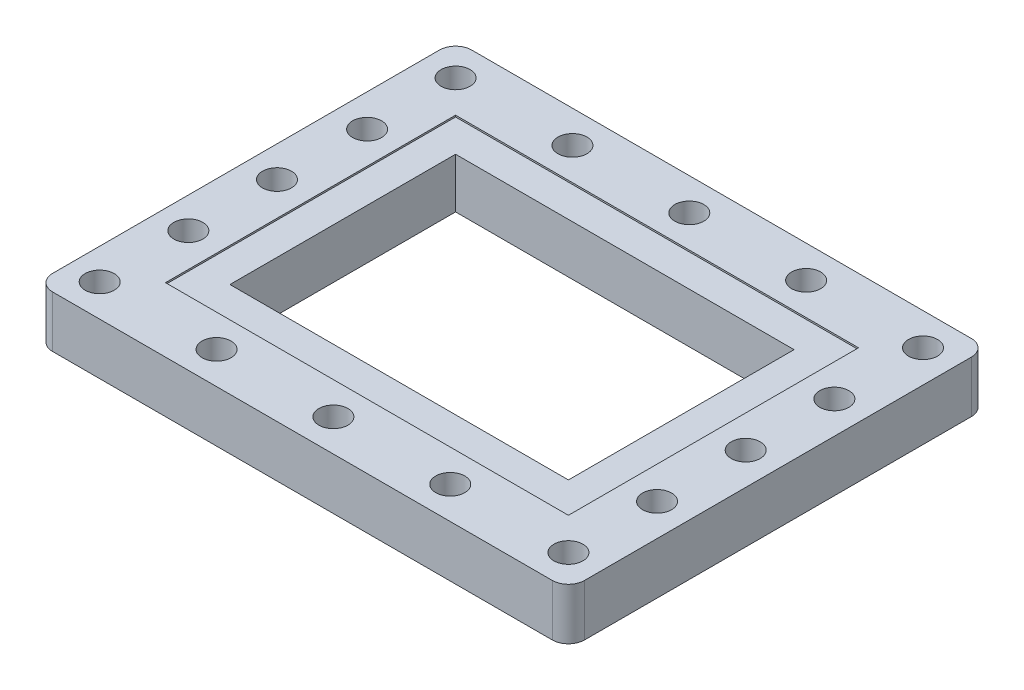
ISO-10303-21;
HEADER;
FILE_DESCRIPTION(('STEP AP214'),'2;1');
FILE_NAME('part.step','',(''),(''),'','','');
FILE_SCHEMA(('AUTOMOTIVE_DESIGN { 1 0 10303 214 1 1 1 1 }'));
ENDSEC;
DATA;
#1=APPLICATION_CONTEXT('core data for automotive mechanical design processes');
#2=APPLICATION_PROTOCOL_DEFINITION('international standard','automotive_design',2000,#1);
#3=PRODUCT_CONTEXT('',#1,'mechanical');
#4=PRODUCT('Part','Part','',(#3));
#5=PRODUCT_RELATED_PRODUCT_CATEGORY('part','',(#4));
#6=PRODUCT_DEFINITION_FORMATION('','',#4);
#7=PRODUCT_DEFINITION_CONTEXT('part definition',#1,'design');
#8=PRODUCT_DEFINITION('design','',#6,#7);
#9=PRODUCT_DEFINITION_SHAPE('','',#8);
#10=(LENGTH_UNIT() NAMED_UNIT(*) SI_UNIT(.MILLI.,.METRE.));
#11=(NAMED_UNIT(*) PLANE_ANGLE_UNIT() SI_UNIT($,.RADIAN.));
#12=(NAMED_UNIT(*) SI_UNIT($,.STERADIAN.) SOLID_ANGLE_UNIT());
#13=UNCERTAINTY_MEASURE_WITH_UNIT(LENGTH_MEASURE(1.E-05),#10,'distance_accuracy_value','');
#14=(GEOMETRIC_REPRESENTATION_CONTEXT(3) GLOBAL_UNCERTAINTY_ASSIGNED_CONTEXT((#13)) GLOBAL_UNIT_ASSIGNED_CONTEXT((#10,
#11,#12)) REPRESENTATION_CONTEXT('',''));
#15=CARTESIAN_POINT('',(0.,0.,0.));
#16=DIRECTION('',(0.,0.,1.));
#17=DIRECTION('',(1.,0.,0.));
#18=AXIS2_PLACEMENT_3D('',#15,#16,#17);
#19=CARTESIAN_POINT('',(-14.6839546191248,3.1,-10.0891410048622));
#20=DIRECTION('',(1.,0.,0.));
#21=DIRECTION('',(0.,0.,-1.));
#22=AXIS2_PLACEMENT_3D('',#19,#20,#21);
#23=PLANE('',#22);
#24=DIRECTION('',(0.,0.,1.));
#25=VECTOR('',#24,1.);
#26=CARTESIAN_POINT('',(-14.6839546191248,0.,-10.0891410048622));
#27=LINE('',#26,#25);
#28=CARTESIAN_POINT('',(-14.6839546191248,0.,-9.08914100486224));
#29=VERTEX_POINT('',#28);
#30=CARTESIAN_POINT('',(-14.6839546191248,0.,14.9108589951378));
#31=VERTEX_POINT('',#30);
#32=EDGE_CURVE('E356',#29,#31,#27,.T.);
#33=ORIENTED_EDGE('',*,*,#32,.T.);
#34=DIRECTION('',(0.,-1.,0.));
#35=VECTOR('',#34,1.);
#36=CARTESIAN_POINT('',(-14.6839546191248,3.1,14.9108589951378));
#37=LINE('',#36,#35);
#38=CARTESIAN_POINT('',(-14.6839546191248,3.2,14.9108589951378));
#39=VERTEX_POINT('',#38);
#40=EDGE_CURVE('E12',#31,#39,#37,.F.);
#41=ORIENTED_EDGE('',*,*,#40,.T.);
#42=DIRECTION('',(0.,0.,1.));
#43=VECTOR('',#42,1.);
#44=CARTESIAN_POINT('',(-14.6839546191248,3.2,0.));
#45=LINE('',#44,#43);
#46=CARTESIAN_POINT('',(-14.6839546191248,3.2,-9.08914100486224));
#47=VERTEX_POINT('',#46);
#48=EDGE_CURVE('E330',#47,#39,#45,.T.);
#49=ORIENTED_EDGE('',*,*,#48,.F.);
#50=DIRECTION('',(0.,-1.,0.));
#51=VECTOR('',#50,1.);
#52=CARTESIAN_POINT('',(-14.6839546191248,3.1,-9.08914100486224));
#53=LINE('',#52,#51);
#54=EDGE_CURVE('E79',#47,#29,#53,.T.);
#55=ORIENTED_EDGE('',*,*,#54,.T.);
#56=EDGE_LOOP('',(#33,#41,#49,#55));
#57=FACE_BOUND('',#56,.T.);
#58=ADVANCED_FACE('F71',(#57),#23,.F.);
#59=CARTESIAN_POINT('',(-14.6839546191248,3.1,15.9108589951378));
#60=DIRECTION('',(0.,0.,-1.));
#61=DIRECTION('',(-1.,0.,0.));
#62=AXIS2_PLACEMENT_3D('',#59,#60,#61);
#63=PLANE('',#62);
#64=DIRECTION('',(1.,0.,0.));
#65=VECTOR('',#64,1.);
#66=CARTESIAN_POINT('',(-14.6839546191248,0.,15.9108589951378));
#67=LINE('',#66,#65);
#68=CARTESIAN_POINT('',(-13.6839546191248,0.,15.9108589951378));
#69=VERTEX_POINT('',#68);
#70=CARTESIAN_POINT('',(17.3160453808752,0.,15.9108589951378));
#71=VERTEX_POINT('',#70);
#72=EDGE_CURVE('E363',#69,#71,#67,.T.);
#73=ORIENTED_EDGE('',*,*,#72,.T.);
#74=DIRECTION('',(0.,-1.,0.));
#75=VECTOR('',#74,1.);
#76=CARTESIAN_POINT('',(17.3160453808752,3.1,15.9108589951378));
#77=LINE('',#76,#75);
#78=CARTESIAN_POINT('',(17.3160453808752,3.2,15.9108589951378));
#79=VERTEX_POINT('',#78);
#80=EDGE_CURVE('E388',#71,#79,#77,.F.);
#81=ORIENTED_EDGE('',*,*,#80,.T.);
#82=DIRECTION('',(1.,0.,0.));
#83=VECTOR('',#82,1.);
#84=CARTESIAN_POINT('',(0.,3.2,15.9108589951378));
#85=LINE('',#84,#83);
#86=CARTESIAN_POINT('',(-13.6839546191248,3.2,15.9108589951378));
#87=VERTEX_POINT('',#86);
#88=EDGE_CURVE('E333',#87,#79,#85,.T.);
#89=ORIENTED_EDGE('',*,*,#88,.F.);
#90=DIRECTION('',(0.,-1.,0.));
#91=VECTOR('',#90,1.);
#92=CARTESIAN_POINT('',(-13.6839546191248,3.1,15.9108589951378));
#93=LINE('',#92,#91);
#94=EDGE_CURVE('E385',#87,#69,#93,.T.);
#95=ORIENTED_EDGE('',*,*,#94,.T.);
#96=EDGE_LOOP('',(#73,#81,#89,#95));
#97=FACE_BOUND('',#96,.T.);
#98=ADVANCED_FACE('F420',(#97),#63,.F.);
#99=CARTESIAN_POINT('',(18.3160453808752,3.1,-10.0891410048622));
#100=DIRECTION('',(-1.,0.,0.));
#101=DIRECTION('',(0.,0.,1.));
#102=AXIS2_PLACEMENT_3D('',#99,#100,#101);
#103=PLANE('',#102);
#104=DIRECTION('',(0.,0.,-1.));
#105=VECTOR('',#104,1.);
#106=CARTESIAN_POINT('',(18.3160453808752,3.2,0.));
#107=LINE('',#106,#105);
#108=CARTESIAN_POINT('',(18.3160453808752,3.2,14.9108589951378));
#109=VERTEX_POINT('',#108);
#110=CARTESIAN_POINT('',(18.3160453808752,3.2,-9.08914100486224));
#111=VERTEX_POINT('',#110);
#112=EDGE_CURVE('E324',#109,#111,#107,.T.);
#113=ORIENTED_EDGE('',*,*,#112,.F.);
#114=DIRECTION('',(0.,-1.,0.));
#115=VECTOR('',#114,1.);
#116=CARTESIAN_POINT('',(18.3160453808752,3.1,14.9108589951378));
#117=LINE('',#116,#115);
#118=CARTESIAN_POINT('',(18.3160453808752,0.,14.9108589951378));
#119=VERTEX_POINT('',#118);
#120=EDGE_CURVE('E374',#109,#119,#117,.T.);
#121=ORIENTED_EDGE('',*,*,#120,.T.);
#122=DIRECTION('',(0.,0.,-1.));
#123=VECTOR('',#122,1.);
#124=CARTESIAN_POINT('',(18.3160453808752,0.,-10.0891410048622));
#125=LINE('',#124,#123);
#126=CARTESIAN_POINT('',(18.3160453808752,0.,-9.08914100486224));
#127=VERTEX_POINT('',#126);
#128=EDGE_CURVE('E366',#119,#127,#125,.T.);
#129=ORIENTED_EDGE('',*,*,#128,.T.);
#130=DIRECTION('',(0.,-1.,0.));
#131=VECTOR('',#130,1.);
#132=CARTESIAN_POINT('',(18.3160453808752,3.1,-9.08914100486224));
#133=LINE('',#132,#131);
#134=EDGE_CURVE('E372',#127,#111,#133,.F.);
#135=ORIENTED_EDGE('',*,*,#134,.T.);
#136=EDGE_LOOP('',(#113,#121,#129,#135));
#137=FACE_BOUND('',#136,.T.);
#138=ADVANCED_FACE('F431',(#137),#103,.F.);
#139=CARTESIAN_POINT('',(-14.6839546191248,3.1,-10.0891410048622));
#140=DIRECTION('',(0.,0.,1.));
#141=DIRECTION('',(1.,0.,0.));
#142=AXIS2_PLACEMENT_3D('',#139,#140,#141);
#143=PLANE('',#142);
#144=DIRECTION('',(-1.,0.,0.));
#145=VECTOR('',#144,1.);
#146=CARTESIAN_POINT('',(0.,3.2,-10.0891410048622));
#147=LINE('',#146,#145);
#148=CARTESIAN_POINT('',(17.3160453808752,3.2,-10.0891410048622));
#149=VERTEX_POINT('',#148);
#150=CARTESIAN_POINT('',(-13.6839546191248,3.2,-10.0891410048622));
#151=VERTEX_POINT('',#150);
#152=EDGE_CURVE('E327',#149,#151,#147,.T.);
#153=ORIENTED_EDGE('',*,*,#152,.F.);
#154=DIRECTION('',(0.,-1.,0.));
#155=VECTOR('',#154,1.);
#156=CARTESIAN_POINT('',(17.3160453808752,3.1,-10.0891410048622));
#157=LINE('',#156,#155);
#158=CARTESIAN_POINT('',(17.3160453808752,0.,-10.0891410048622));
#159=VERTEX_POINT('',#158);
#160=EDGE_CURVE('E400',#149,#159,#157,.T.);
#161=ORIENTED_EDGE('',*,*,#160,.T.);
#162=DIRECTION('',(-1.,0.,0.));
#163=VECTOR('',#162,1.);
#164=CARTESIAN_POINT('',(-14.6839546191248,0.,-10.0891410048622));
#165=LINE('',#164,#163);
#166=CARTESIAN_POINT('',(-13.6839546191248,0.,-10.0891410048622));
#167=VERTEX_POINT('',#166);
#168=EDGE_CURVE('E369',#159,#167,#165,.T.);
#169=ORIENTED_EDGE('',*,*,#168,.T.);
#170=DIRECTION('',(0.,-1.,0.));
#171=VECTOR('',#170,1.);
#172=CARTESIAN_POINT('',(-13.6839546191248,3.1,-10.0891410048622));
#173=LINE('',#172,#171);
#174=EDGE_CURVE('E398',#167,#151,#173,.F.);
#175=ORIENTED_EDGE('',*,*,#174,.T.);
#176=EDGE_LOOP('',(#153,#161,#169,#175));
#177=FACE_BOUND('',#176,.T.);
#178=ADVANCED_FACE('F439',(#177),#143,.F.);
#179=CARTESIAN_POINT('',(0.,0.,0.));
#180=DIRECTION('',(0.,1.,0.));
#181=DIRECTION('',(0.,0.,1.));
#182=AXIS2_PLACEMENT_3D('',#179,#180,#181);
#183=PLANE('',#182);
#184=DIRECTION('',(-1.,0.,0.));
#185=VECTOR('',#184,1.);
#186=CARTESIAN_POINT('',(-8.6839546191248,0.,-4.08914100486223));
#187=LINE('',#186,#185);
#188=CARTESIAN_POINT('',(12.3160453808752,0.,-4.08914100486223));
#189=VERTEX_POINT('',#188);
#190=CARTESIAN_POINT('',(-8.6839546191248,0.,-4.08914100486223));
#191=VERTEX_POINT('',#190);
#192=EDGE_CURVE('E194',#189,#191,#187,.T.);
#193=ORIENTED_EDGE('',*,*,#192,.T.);
#194=DIRECTION('',(0.,0.,1.));
#195=VECTOR('',#194,1.);
#196=CARTESIAN_POINT('',(-8.6839546191248,0.,-4.08914100486223));
#197=LINE('',#196,#195);
#198=CARTESIAN_POINT('',(-8.68395461912479,0.,9.91085899513776));
#199=VERTEX_POINT('',#198);
#200=EDGE_CURVE('E186',#191,#199,#197,.T.);
#201=ORIENTED_EDGE('',*,*,#200,.T.);
#202=DIRECTION('',(1.,0.,0.));
#203=VECTOR('',#202,1.);
#204=CARTESIAN_POINT('',(-8.68395461912479,0.,9.91085899513776));
#205=LINE('',#204,#203);
#206=CARTESIAN_POINT('',(12.3160453808752,0.,9.91085899513776));
#207=VERTEX_POINT('',#206);
#208=EDGE_CURVE('E197',#199,#207,#205,.T.);
#209=ORIENTED_EDGE('',*,*,#208,.T.);
#210=DIRECTION('',(0.,0.,-1.));
#211=VECTOR('',#210,1.);
#212=CARTESIAN_POINT('',(12.3160453808752,0.,-4.08914100486223));
#213=LINE('',#212,#211);
#214=EDGE_CURVE('E91',#207,#189,#213,.T.);
#215=ORIENTED_EDGE('',*,*,#214,.T.);
#216=EDGE_LOOP('',(#193,#201,#209,#215));
#217=FACE_BOUND('',#216,.T.);
#218=CARTESIAN_POINT('',(-12.6839546191248,0.,-8.08914100486223));
#219=DIRECTION('',(0.,1.,0.));
#220=DIRECTION('',(0.,0.,1.));
#221=AXIS2_PLACEMENT_3D('',#218,#219,#220);
#222=CIRCLE('',#221,0.9);
#223=CARTESIAN_POINT('',(-12.6839546191248,0.,-7.18914100486224));
#224=VERTEX_POINT('',#223);
#225=EDGE_CURVE('E223',#224,#224,#222,.T.);
#226=ORIENTED_EDGE('',*,*,#225,.T.);
#227=EDGE_LOOP('',(#226));
#228=FACE_BOUND('',#227,.T.);
#229=CARTESIAN_POINT('',(-12.6745256875154,0.,-2.58914100486224));
#230=DIRECTION('',(0.,1.,0.));
#231=DIRECTION('',(0.,0.,1.));
#232=AXIS2_PLACEMENT_3D('',#229,#230,#231);
#233=CIRCLE('',#232,0.9);
#234=CARTESIAN_POINT('',(-12.6745256875154,0.,-1.68914100486224));
#235=VERTEX_POINT('',#234);
#236=EDGE_CURVE('E229',#235,#235,#233,.T.);
#237=ORIENTED_EDGE('',*,*,#236,.T.);
#238=EDGE_LOOP('',(#237));
#239=FACE_BOUND('',#238,.T.);
#240=CARTESIAN_POINT('',(-12.7647059813043,0.,2.91085899513776));
#241=DIRECTION('',(0.,1.,0.));
#242=DIRECTION('',(0.,0.,1.));
#243=AXIS2_PLACEMENT_3D('',#240,#241,#242);
#244=CIRCLE('',#243,0.9);
#245=CARTESIAN_POINT('',(-12.7647059813043,0.,3.81085899513776));
#246=VERTEX_POINT('',#245);
#247=EDGE_CURVE('E235',#246,#246,#244,.T.);
#248=ORIENTED_EDGE('',*,*,#247,.T.);
#249=EDGE_LOOP('',(#248));
#250=FACE_BOUND('',#249,.T.);
#251=CARTESIAN_POINT('',(-12.7647059813043,0.,8.41085899513776));
#252=DIRECTION('',(0.,1.,0.));
#253=DIRECTION('',(0.,0.,1.));
#254=AXIS2_PLACEMENT_3D('',#251,#252,#253);
#255=CIRCLE('',#254,0.9);
#256=CARTESIAN_POINT('',(-12.7647059813043,0.,9.31085899513776));
#257=VERTEX_POINT('',#256);
#258=EDGE_CURVE('E241',#257,#257,#255,.T.);
#259=ORIENTED_EDGE('',*,*,#258,.T.);
#260=EDGE_LOOP('',(#259));
#261=FACE_BOUND('',#260,.T.);
#262=CARTESIAN_POINT('',(-12.7647059813043,0.,13.9108589951378));
#263=DIRECTION('',(0.,1.,0.));
#264=DIRECTION('',(0.,0.,1.));
#265=AXIS2_PLACEMENT_3D('',#262,#263,#264);
#266=CIRCLE('',#265,0.9);
#267=CARTESIAN_POINT('',(-12.7647059813043,0.,14.8108589951378));
#268=VERTEX_POINT('',#267);
#269=EDGE_CURVE('E247',#268,#268,#266,.T.);
#270=ORIENTED_EDGE('',*,*,#269,.T.);
#271=EDGE_LOOP('',(#270));
#272=FACE_BOUND('',#271,.T.);
#273=CARTESIAN_POINT('',(-5.4339546191248,0.,-8.08914100486223));
#274=DIRECTION('',(0.,1.,0.));
#275=DIRECTION('',(0.,0.,1.));
#276=AXIS2_PLACEMENT_3D('',#273,#274,#275);
#277=CIRCLE('',#276,0.899999999999999);
#278=CARTESIAN_POINT('',(-5.4339546191248,0.,-7.18914100486224));
#279=VERTEX_POINT('',#278);
#280=EDGE_CURVE('E253',#279,#279,#277,.T.);
#281=ORIENTED_EDGE('',*,*,#280,.T.);
#282=EDGE_LOOP('',(#281));
#283=FACE_BOUND('',#282,.T.);
#284=CARTESIAN_POINT('',(1.8160453808752,0.,-8.08914100486223));
#285=DIRECTION('',(0.,1.,0.));
#286=DIRECTION('',(0.,0.,1.));
#287=AXIS2_PLACEMENT_3D('',#284,#285,#286);
#288=CIRCLE('',#287,0.899999999999999);
#289=CARTESIAN_POINT('',(1.8160453808752,0.,-7.18914100486224));
#290=VERTEX_POINT('',#289);
#291=EDGE_CURVE('E259',#290,#290,#288,.T.);
#292=ORIENTED_EDGE('',*,*,#291,.T.);
#293=EDGE_LOOP('',(#292));
#294=FACE_BOUND('',#293,.T.);
#295=CARTESIAN_POINT('',(1.73529401869575,0.,13.9108589951378));
#296=DIRECTION('',(0.,1.,0.));
#297=DIRECTION('',(0.,0.,1.));
#298=AXIS2_PLACEMENT_3D('',#295,#296,#297);
#299=CIRCLE('',#298,0.899999999999999);
#300=CARTESIAN_POINT('',(1.73529401869575,0.,14.8108589951378));
#301=VERTEX_POINT('',#300);
#302=EDGE_CURVE('E265',#301,#301,#299,.T.);
#303=ORIENTED_EDGE('',*,*,#302,.T.);
#304=EDGE_LOOP('',(#303));
#305=FACE_BOUND('',#304,.T.);
#306=CARTESIAN_POINT('',(-5.51470598130425,0.,13.9108589951378));
#307=DIRECTION('',(0.,1.,0.));
#308=DIRECTION('',(0.,0.,1.));
#309=AXIS2_PLACEMENT_3D('',#306,#307,#308);
#310=CIRCLE('',#309,0.899999999999999);
#311=CARTESIAN_POINT('',(-5.51470598130425,0.,14.8108589951378));
#312=VERTEX_POINT('',#311);
#313=EDGE_CURVE('E271',#312,#312,#310,.T.);
#314=ORIENTED_EDGE('',*,*,#313,.T.);
#315=EDGE_LOOP('',(#314));
#316=FACE_BOUND('',#315,.T.);
#317=CARTESIAN_POINT('',(9.0660453808752,0.,-8.08914100486223));
#318=DIRECTION('',(0.,1.,0.));
#319=DIRECTION('',(0.,0.,1.));
#320=AXIS2_PLACEMENT_3D('',#317,#318,#319);
#321=CIRCLE('',#320,0.9);
#322=CARTESIAN_POINT('',(9.0660453808752,0.,-7.18914100486224));
#323=VERTEX_POINT('',#322);
#324=EDGE_CURVE('E277',#323,#323,#321,.T.);
#325=ORIENTED_EDGE('',*,*,#324,.T.);
#326=EDGE_LOOP('',(#325));
#327=FACE_BOUND('',#326,.T.);
#328=CARTESIAN_POINT('',(16.3160453808752,0.,-8.08914100486223));
#329=DIRECTION('',(0.,1.,0.));
#330=DIRECTION('',(0.,0.,1.));
#331=AXIS2_PLACEMENT_3D('',#328,#329,#330);
#332=CIRCLE('',#331,0.899999999999998);
#333=CARTESIAN_POINT('',(16.3160453808752,0.,-7.18914100486224));
#334=VERTEX_POINT('',#333);
#335=EDGE_CURVE('E283',#334,#334,#332,.T.);
#336=ORIENTED_EDGE('',*,*,#335,.T.);
#337=EDGE_LOOP('',(#336));
#338=FACE_BOUND('',#337,.T.);
#339=CARTESIAN_POINT('',(16.3160453808752,0.,-2.58914100486224));
#340=DIRECTION('',(0.,1.,0.));
#341=DIRECTION('',(0.,0.,1.));
#342=AXIS2_PLACEMENT_3D('',#339,#340,#341);
#343=CIRCLE('',#342,0.899999999999998);
#344=CARTESIAN_POINT('',(16.3160453808752,0.,-1.68914100486224));
#345=VERTEX_POINT('',#344);
#346=EDGE_CURVE('E289',#345,#345,#343,.T.);
#347=ORIENTED_EDGE('',*,*,#346,.T.);
#348=EDGE_LOOP('',(#347));
#349=FACE_BOUND('',#348,.T.);
#350=CARTESIAN_POINT('',(16.3160453808752,0.,2.91085899513776));
#351=DIRECTION('',(0.,1.,0.));
#352=DIRECTION('',(0.,0.,1.));
#353=AXIS2_PLACEMENT_3D('',#350,#351,#352);
#354=CIRCLE('',#353,0.899999999999998);
#355=CARTESIAN_POINT('',(16.3160453808752,0.,3.81085899513776));
#356=VERTEX_POINT('',#355);
#357=EDGE_CURVE('E295',#356,#356,#354,.T.);
#358=ORIENTED_EDGE('',*,*,#357,.T.);
#359=EDGE_LOOP('',(#358));
#360=FACE_BOUND('',#359,.T.);
#361=CARTESIAN_POINT('',(16.3160453808752,0.,8.41085899513776));
#362=DIRECTION('',(0.,1.,0.));
#363=DIRECTION('',(0.,0.,1.));
#364=AXIS2_PLACEMENT_3D('',#361,#362,#363);
#365=CIRCLE('',#364,0.899999999999998);
#366=CARTESIAN_POINT('',(16.3160453808752,0.,9.31085899513776));
#367=VERTEX_POINT('',#366);
#368=EDGE_CURVE('E301',#367,#367,#365,.T.);
#369=ORIENTED_EDGE('',*,*,#368,.T.);
#370=EDGE_LOOP('',(#369));
#371=FACE_BOUND('',#370,.T.);
#372=CARTESIAN_POINT('',(16.3160453808752,0.,13.9108589951378));
#373=DIRECTION('',(0.,1.,0.));
#374=DIRECTION('',(0.,0.,1.));
#375=AXIS2_PLACEMENT_3D('',#372,#373,#374);
#376=CIRCLE('',#375,0.899999999999998);
#377=CARTESIAN_POINT('',(16.3160453808752,0.,14.8108589951378));
#378=VERTEX_POINT('',#377);
#379=EDGE_CURVE('E307',#378,#378,#376,.T.);
#380=ORIENTED_EDGE('',*,*,#379,.T.);
#381=EDGE_LOOP('',(#380));
#382=FACE_BOUND('',#381,.T.);
#383=CARTESIAN_POINT('',(8.98529401869575,0.,13.9108589951378));
#384=DIRECTION('',(0.,1.,0.));
#385=DIRECTION('',(0.,0.,1.));
#386=AXIS2_PLACEMENT_3D('',#383,#384,#385);
#387=CIRCLE('',#386,0.9);
#388=CARTESIAN_POINT('',(8.98529401869575,0.,14.8108589951378));
#389=VERTEX_POINT('',#388);
#390=EDGE_CURVE('E313',#389,#389,#387,.T.);
#391=ORIENTED_EDGE('',*,*,#390,.T.);
#392=EDGE_LOOP('',(#391));
#393=FACE_BOUND('',#392,.T.);
#394=ORIENTED_EDGE('',*,*,#128,.F.);
#395=CARTESIAN_POINT('',(17.3160453808752,0.,14.9108589951378));
#396=DIRECTION('',(0.,1.,0.));
#397=DIRECTION('',(0.,0.,1.));
#398=AXIS2_PLACEMENT_3D('',#395,#396,#397);
#399=CIRCLE('',#398,1.);
#400=EDGE_CURVE('E383',#119,#71,#399,.F.);
#401=ORIENTED_EDGE('',*,*,#400,.T.);
#402=ORIENTED_EDGE('',*,*,#72,.F.);
#403=CARTESIAN_POINT('',(-13.6839546191248,0.,14.9108589951378));
#404=DIRECTION('',(0.,1.,0.));
#405=DIRECTION('',(0.,0.,1.));
#406=AXIS2_PLACEMENT_3D('',#403,#404,#405);
#407=CIRCLE('',#406,1.);
#408=EDGE_CURVE('E379',#69,#31,#407,.F.);
#409=ORIENTED_EDGE('',*,*,#408,.T.);
#410=ORIENTED_EDGE('',*,*,#32,.F.);
#411=CARTESIAN_POINT('',(-13.6839546191248,0.,-9.08914100486224));
#412=DIRECTION('',(0.,1.,0.));
#413=DIRECTION('',(0.,0.,1.));
#414=AXIS2_PLACEMENT_3D('',#411,#412,#413);
#415=CIRCLE('',#414,1.);
#416=EDGE_CURVE('E377',#29,#167,#415,.F.);
#417=ORIENTED_EDGE('',*,*,#416,.T.);
#418=ORIENTED_EDGE('',*,*,#168,.F.);
#419=CARTESIAN_POINT('',(17.3160453808752,0.,-9.08914100486224));
#420=DIRECTION('',(0.,1.,0.));
#421=DIRECTION('',(0.,0.,1.));
#422=AXIS2_PLACEMENT_3D('',#419,#420,#421);
#423=CIRCLE('',#422,1.);
#424=EDGE_CURVE('E381',#159,#127,#423,.F.);
#425=ORIENTED_EDGE('',*,*,#424,.T.);
#426=EDGE_LOOP('',(#394,#401,#402,#409,#410,#417,#418,#425));
#427=FACE_BOUND('',#426,.T.);
#428=ADVANCED_FACE('F201',(#217,#228,#239,#250,#261,#272,#283,#294,#305,#316,#327,#338,#349,
#360,#371,#382,#393,#427),#183,.F.);
#429=CARTESIAN_POINT('',(0.,3.2,-6.08914100486223));
#430=DIRECTION('',(0.,0.,-1.));
#431=DIRECTION('',(-1.,0.,0.));
#432=AXIS2_PLACEMENT_3D('',#429,#430,#431);
#433=PLANE('',#432);
#434=DIRECTION('',(0.,-1.,0.));
#435=VECTOR('',#434,1.);
#436=CARTESIAN_POINT('',(14.3160453808752,3.2,-6.08914100486223));
#437=LINE('',#436,#435);
#438=CARTESIAN_POINT('',(14.3160453808752,3.2,-6.08914100486223));
#439=VERTEX_POINT('',#438);
#440=CARTESIAN_POINT('',(14.3160453808752,3.1,-6.08914100486224));
#441=VERTEX_POINT('',#440);
#442=EDGE_CURVE('E353',#439,#441,#437,.T.);
#443=ORIENTED_EDGE('',*,*,#442,.F.);
#444=DIRECTION('',(1.,0.,0.));
#445=VECTOR('',#444,1.);
#446=CARTESIAN_POINT('',(0.,3.2,-6.08914100486223));
#447=LINE('',#446,#445);
#448=CARTESIAN_POINT('',(-10.6839546191248,3.2,-6.08914100486223));
#449=VERTEX_POINT('',#448);
#450=EDGE_CURVE('E320',#449,#439,#447,.T.);
#451=ORIENTED_EDGE('',*,*,#450,.F.);
#452=DIRECTION('',(0.,-1.,0.));
#453=VECTOR('',#452,1.);
#454=CARTESIAN_POINT('',(-10.6839546191248,3.2,-6.08914100486223));
#455=LINE('',#454,#453);
#456=CARTESIAN_POINT('',(-10.6839546191248,3.1,-6.08914100486223));
#457=VERTEX_POINT('',#456);
#458=EDGE_CURVE('E349',#449,#457,#455,.T.);
#459=ORIENTED_EDGE('',*,*,#458,.T.);
#460=DIRECTION('',(1.,0.,0.));
#461=VECTOR('',#460,1.);
#462=CARTESIAN_POINT('',(0.,3.1,-6.08914100486223));
#463=LINE('',#462,#461);
#464=EDGE_CURVE('E343',#457,#441,#463,.T.);
#465=ORIENTED_EDGE('',*,*,#464,.T.);
#466=EDGE_LOOP('',(#443,#451,#459,#465));
#467=FACE_BOUND('',#466,.T.);
#468=ADVANCED_FACE('F483',(#467),#433,.F.);
#469=CARTESIAN_POINT('',(0.,3.2,11.9108589951378));
#470=DIRECTION('',(0.,0.,-1.));
#471=DIRECTION('',(-1.,0.,0.));
#472=AXIS2_PLACEMENT_3D('',#469,#470,#471);
#473=PLANE('',#472);
#474=DIRECTION('',(1.,0.,0.));
#475=VECTOR('',#474,1.);
#476=CARTESIAN_POINT('',(0.,3.2,11.9108589951378));
#477=LINE('',#476,#475);
#478=CARTESIAN_POINT('',(-10.6839546191248,3.2,11.9108589951378));
#479=VERTEX_POINT('',#478);
#480=CARTESIAN_POINT('',(14.3160453808752,3.2,11.9108589951378));
#481=VERTEX_POINT('',#480);
#482=EDGE_CURVE('E336',#479,#481,#477,.T.);
#483=ORIENTED_EDGE('',*,*,#482,.T.);
#484=DIRECTION('',(0.,-1.,0.));
#485=VECTOR('',#484,1.);
#486=CARTESIAN_POINT('',(14.3160453808752,3.2,11.9108589951378));
#487=LINE('',#486,#485);
#488=CARTESIAN_POINT('',(14.3160453808752,3.1,11.9108589951378));
#489=VERTEX_POINT('',#488);
#490=EDGE_CURVE('E351',#481,#489,#487,.T.);
#491=ORIENTED_EDGE('',*,*,#490,.T.);
#492=DIRECTION('',(1.,0.,0.));
#493=VECTOR('',#492,1.);
#494=CARTESIAN_POINT('',(0.,3.1,11.9108589951378));
#495=LINE('',#494,#493);
#496=CARTESIAN_POINT('',(-10.6839546191248,3.1,11.9108589951378));
#497=VERTEX_POINT('',#496);
#498=EDGE_CURVE('E321',#497,#489,#495,.T.);
#499=ORIENTED_EDGE('',*,*,#498,.F.);
#500=DIRECTION('',(0.,-1.,0.));
#501=VECTOR('',#500,1.);
#502=CARTESIAN_POINT('',(-10.6839546191248,3.2,11.9108589951378));
#503=LINE('',#502,#501);
#504=EDGE_CURVE('E339',#479,#497,#503,.T.);
#505=ORIENTED_EDGE('',*,*,#504,.F.);
#506=EDGE_LOOP('',(#483,#491,#499,#505));
#507=FACE_BOUND('',#506,.T.);
#508=ADVANCED_FACE('F601',(#507),#473,.T.);
#509=CARTESIAN_POINT('',(-10.6839546191248,3.2,0.));
#510=DIRECTION('',(1.,0.,0.));
#511=DIRECTION('',(0.,0.,-1.));
#512=AXIS2_PLACEMENT_3D('',#509,#510,#511);
#513=PLANE('',#512);
#514=DIRECTION('',(0.,0.,1.));
#515=VECTOR('',#514,1.);
#516=CARTESIAN_POINT('',(-10.6839546191248,3.1,0.));
#517=LINE('',#516,#515);
#518=EDGE_CURVE('E340',#457,#497,#517,.T.);
#519=ORIENTED_EDGE('',*,*,#518,.F.);
#520=ORIENTED_EDGE('',*,*,#458,.F.);
#521=DIRECTION('',(0.,0.,1.));
#522=VECTOR('',#521,1.);
#523=CARTESIAN_POINT('',(-10.6839546191248,3.2,0.));
#524=LINE('',#523,#522);
#525=EDGE_CURVE('E317',#449,#479,#524,.T.);
#526=ORIENTED_EDGE('',*,*,#525,.T.);
#527=ORIENTED_EDGE('',*,*,#504,.T.);
#528=EDGE_LOOP('',(#519,#520,#526,#527));
#529=FACE_BOUND('',#528,.T.);
#530=ADVANCED_FACE('F599',(#529),#513,.T.);
#531=CARTESIAN_POINT('',(0.,3.2,0.));
#532=DIRECTION('',(0.,1.,0.));
#533=DIRECTION('',(0.,0.,1.));
#534=AXIS2_PLACEMENT_3D('',#531,#532,#533);
#535=PLANE('',#534);
#536=CARTESIAN_POINT('',(-12.6839546191248,3.2,-8.08914100486223));
#537=DIRECTION('',(0.,1.,0.));
#538=DIRECTION('',(0.,0.,1.));
#539=AXIS2_PLACEMENT_3D('',#536,#537,#538);
#540=CIRCLE('',#539,0.9);
#541=CARTESIAN_POINT('',(-12.6839546191248,3.2,-7.18914100486224));
#542=VERTEX_POINT('',#541);
#543=EDGE_CURVE('E217',#542,#542,#540,.T.);
#544=ORIENTED_EDGE('',*,*,#543,.F.);
#545=EDGE_LOOP('',(#544));
#546=FACE_BOUND('',#545,.T.);
#547=CARTESIAN_POINT('',(-12.6745256875154,3.2,-2.58914100486224));
#548=DIRECTION('',(0.,1.,0.));
#549=DIRECTION('',(0.,0.,1.));
#550=AXIS2_PLACEMENT_3D('',#547,#548,#549);
#551=CIRCLE('',#550,0.9);
#552=CARTESIAN_POINT('',(-12.6745256875154,3.2,-1.68914100486224));
#553=VERTEX_POINT('',#552);
#554=EDGE_CURVE('E226',#553,#553,#551,.T.);
#555=ORIENTED_EDGE('',*,*,#554,.F.);
#556=EDGE_LOOP('',(#555));
#557=FACE_BOUND('',#556,.T.);
#558=CARTESIAN_POINT('',(-12.7647059813043,3.2,2.91085899513776));
#559=DIRECTION('',(0.,1.,0.));
#560=DIRECTION('',(0.,0.,1.));
#561=AXIS2_PLACEMENT_3D('',#558,#559,#560);
#562=CIRCLE('',#561,0.9);
#563=CARTESIAN_POINT('',(-12.7647059813043,3.2,3.81085899513776));
#564=VERTEX_POINT('',#563);
#565=EDGE_CURVE('E232',#564,#564,#562,.T.);
#566=ORIENTED_EDGE('',*,*,#565,.F.);
#567=EDGE_LOOP('',(#566));
#568=FACE_BOUND('',#567,.T.);
#569=CARTESIAN_POINT('',(-12.7647059813043,3.2,8.41085899513776));
#570=DIRECTION('',(0.,1.,0.));
#571=DIRECTION('',(0.,0.,1.));
#572=AXIS2_PLACEMENT_3D('',#569,#570,#571);
#573=CIRCLE('',#572,0.9);
#574=CARTESIAN_POINT('',(-12.7647059813043,3.2,9.31085899513776));
#575=VERTEX_POINT('',#574);
#576=EDGE_CURVE('E238',#575,#575,#573,.T.);
#577=ORIENTED_EDGE('',*,*,#576,.F.);
#578=EDGE_LOOP('',(#577));
#579=FACE_BOUND('',#578,.T.);
#580=CARTESIAN_POINT('',(-12.7647059813043,3.2,13.9108589951378));
#581=DIRECTION('',(0.,1.,0.));
#582=DIRECTION('',(0.,0.,1.));
#583=AXIS2_PLACEMENT_3D('',#580,#581,#582);
#584=CIRCLE('',#583,0.9);
#585=CARTESIAN_POINT('',(-12.7647059813043,3.2,14.8108589951378));
#586=VERTEX_POINT('',#585);
#587=EDGE_CURVE('E244',#586,#586,#584,.T.);
#588=ORIENTED_EDGE('',*,*,#587,.F.);
#589=EDGE_LOOP('',(#588));
#590=FACE_BOUND('',#589,.T.);
#591=CARTESIAN_POINT('',(-5.4339546191248,3.2,-8.08914100486223));
#592=DIRECTION('',(0.,1.,0.));
#593=DIRECTION('',(0.,0.,1.));
#594=AXIS2_PLACEMENT_3D('',#591,#592,#593);
#595=CIRCLE('',#594,0.9);
#596=CARTESIAN_POINT('',(-5.4339546191248,3.2,-7.18914100486224));
#597=VERTEX_POINT('',#596);
#598=EDGE_CURVE('E250',#597,#597,#595,.T.);
#599=ORIENTED_EDGE('',*,*,#598,.F.);
#600=EDGE_LOOP('',(#599));
#601=FACE_BOUND('',#600,.T.);
#602=CARTESIAN_POINT('',(1.8160453808752,3.2,-8.08914100486223));
#603=DIRECTION('',(0.,1.,0.));
#604=DIRECTION('',(0.,0.,1.));
#605=AXIS2_PLACEMENT_3D('',#602,#603,#604);
#606=CIRCLE('',#605,0.9);
#607=CARTESIAN_POINT('',(1.8160453808752,3.2,-7.18914100486224));
#608=VERTEX_POINT('',#607);
#609=EDGE_CURVE('E256',#608,#608,#606,.T.);
#610=ORIENTED_EDGE('',*,*,#609,.F.);
#611=EDGE_LOOP('',(#610));
#612=FACE_BOUND('',#611,.T.);
#613=CARTESIAN_POINT('',(1.73529401869575,3.2,13.9108589951378));
#614=DIRECTION('',(0.,1.,0.));
#615=DIRECTION('',(0.,0.,1.));
#616=AXIS2_PLACEMENT_3D('',#613,#614,#615);
#617=CIRCLE('',#616,0.9);
#618=CARTESIAN_POINT('',(1.73529401869575,3.2,14.8108589951378));
#619=VERTEX_POINT('',#618);
#620=EDGE_CURVE('E262',#619,#619,#617,.T.);
#621=ORIENTED_EDGE('',*,*,#620,.F.);
#622=EDGE_LOOP('',(#621));
#623=FACE_BOUND('',#622,.T.);
#624=CARTESIAN_POINT('',(-5.51470598130425,3.2,13.9108589951378));
#625=DIRECTION('',(0.,1.,0.));
#626=DIRECTION('',(0.,0.,1.));
#627=AXIS2_PLACEMENT_3D('',#624,#625,#626);
#628=CIRCLE('',#627,0.9);
#629=CARTESIAN_POINT('',(-5.51470598130425,3.2,14.8108589951378));
#630=VERTEX_POINT('',#629);
#631=EDGE_CURVE('E268',#630,#630,#628,.T.);
#632=ORIENTED_EDGE('',*,*,#631,.F.);
#633=EDGE_LOOP('',(#632));
#634=FACE_BOUND('',#633,.T.);
#635=CARTESIAN_POINT('',(9.0660453808752,3.2,-8.08914100486223));
#636=DIRECTION('',(0.,1.,0.));
#637=DIRECTION('',(0.,0.,1.));
#638=AXIS2_PLACEMENT_3D('',#635,#636,#637);
#639=CIRCLE('',#638,0.9);
#640=CARTESIAN_POINT('',(9.0660453808752,3.2,-7.18914100486224));
#641=VERTEX_POINT('',#640);
#642=EDGE_CURVE('E274',#641,#641,#639,.T.);
#643=ORIENTED_EDGE('',*,*,#642,.F.);
#644=EDGE_LOOP('',(#643));
#645=FACE_BOUND('',#644,.T.);
#646=CARTESIAN_POINT('',(16.3160453808752,3.2,-8.08914100486223));
#647=DIRECTION('',(0.,1.,0.));
#648=DIRECTION('',(0.,0.,1.));
#649=AXIS2_PLACEMENT_3D('',#646,#647,#648);
#650=CIRCLE('',#649,0.899999999999998);
#651=CARTESIAN_POINT('',(16.3160453808752,3.2,-7.18914100486224));
#652=VERTEX_POINT('',#651);
#653=EDGE_CURVE('E280',#652,#652,#650,.T.);
#654=ORIENTED_EDGE('',*,*,#653,.F.);
#655=EDGE_LOOP('',(#654));
#656=FACE_BOUND('',#655,.T.);
#657=CARTESIAN_POINT('',(16.3160453808752,3.2,-2.58914100486224));
#658=DIRECTION('',(0.,1.,0.));
#659=DIRECTION('',(0.,0.,1.));
#660=AXIS2_PLACEMENT_3D('',#657,#658,#659);
#661=CIRCLE('',#660,0.899999999999998);
#662=CARTESIAN_POINT('',(16.3160453808752,3.2,-1.68914100486224));
#663=VERTEX_POINT('',#662);
#664=EDGE_CURVE('E286',#663,#663,#661,.T.);
#665=ORIENTED_EDGE('',*,*,#664,.F.);
#666=EDGE_LOOP('',(#665));
#667=FACE_BOUND('',#666,.T.);
#668=CARTESIAN_POINT('',(16.3160453808752,3.2,2.91085899513776));
#669=DIRECTION('',(0.,1.,0.));
#670=DIRECTION('',(0.,0.,1.));
#671=AXIS2_PLACEMENT_3D('',#668,#669,#670);
#672=CIRCLE('',#671,0.899999999999998);
#673=CARTESIAN_POINT('',(16.3160453808752,3.2,3.81085899513776));
#674=VERTEX_POINT('',#673);
#675=EDGE_CURVE('E292',#674,#674,#672,.T.);
#676=ORIENTED_EDGE('',*,*,#675,.F.);
#677=EDGE_LOOP('',(#676));
#678=FACE_BOUND('',#677,.T.);
#679=CARTESIAN_POINT('',(16.3160453808752,3.2,8.41085899513776));
#680=DIRECTION('',(0.,1.,0.));
#681=DIRECTION('',(0.,0.,1.));
#682=AXIS2_PLACEMENT_3D('',#679,#680,#681);
#683=CIRCLE('',#682,0.899999999999998);
#684=CARTESIAN_POINT('',(16.3160453808752,3.2,9.31085899513776));
#685=VERTEX_POINT('',#684);
#686=EDGE_CURVE('E298',#685,#685,#683,.T.);
#687=ORIENTED_EDGE('',*,*,#686,.F.);
#688=EDGE_LOOP('',(#687));
#689=FACE_BOUND('',#688,.T.);
#690=CARTESIAN_POINT('',(16.3160453808752,3.2,13.9108589951378));
#691=DIRECTION('',(0.,1.,0.));
#692=DIRECTION('',(0.,0.,1.));
#693=AXIS2_PLACEMENT_3D('',#690,#691,#692);
#694=CIRCLE('',#693,0.899999999999998);
#695=CARTESIAN_POINT('',(16.3160453808752,3.2,14.8108589951378));
#696=VERTEX_POINT('',#695);
#697=EDGE_CURVE('E304',#696,#696,#694,.T.);
#698=ORIENTED_EDGE('',*,*,#697,.F.);
#699=EDGE_LOOP('',(#698));
#700=FACE_BOUND('',#699,.T.);
#701=CARTESIAN_POINT('',(8.98529401869575,3.2,13.9108589951378));
#702=DIRECTION('',(0.,1.,0.));
#703=DIRECTION('',(0.,0.,1.));
#704=AXIS2_PLACEMENT_3D('',#701,#702,#703);
#705=CIRCLE('',#704,0.9);
#706=CARTESIAN_POINT('',(8.98529401869575,3.2,14.8108589951378));
#707=VERTEX_POINT('',#706);
#708=EDGE_CURVE('E310',#707,#707,#705,.T.);
#709=ORIENTED_EDGE('',*,*,#708,.F.);
#710=EDGE_LOOP('',(#709));
#711=FACE_BOUND('',#710,.T.);
#712=ORIENTED_EDGE('',*,*,#88,.T.);
#713=CARTESIAN_POINT('',(17.3160453808752,3.2,14.9108589951378));
#714=DIRECTION('',(0.,1.,0.));
#715=DIRECTION('',(0.,0.,1.));
#716=AXIS2_PLACEMENT_3D('',#713,#714,#715);
#717=CIRCLE('',#716,1.);
#718=EDGE_CURVE('E396',#79,#109,#717,.T.);
#719=ORIENTED_EDGE('',*,*,#718,.T.);
#720=ORIENTED_EDGE('',*,*,#112,.T.);
#721=CARTESIAN_POINT('',(17.3160453808752,3.2,-9.08914100486224));
#722=DIRECTION('',(0.,1.,0.));
#723=DIRECTION('',(0.,0.,1.));
#724=AXIS2_PLACEMENT_3D('',#721,#722,#723);
#725=CIRCLE('',#724,1.);
#726=EDGE_CURVE('E394',#111,#149,#725,.T.);
#727=ORIENTED_EDGE('',*,*,#726,.T.);
#728=ORIENTED_EDGE('',*,*,#152,.T.);
#729=CARTESIAN_POINT('',(-13.6839546191248,3.2,-9.08914100486224));
#730=DIRECTION('',(0.,1.,0.));
#731=DIRECTION('',(0.,0.,1.));
#732=AXIS2_PLACEMENT_3D('',#729,#730,#731);
#733=CIRCLE('',#732,1.);
#734=EDGE_CURVE('E390',#151,#47,#733,.T.);
#735=ORIENTED_EDGE('',*,*,#734,.T.);
#736=ORIENTED_EDGE('',*,*,#48,.T.);
#737=CARTESIAN_POINT('',(-13.6839546191248,3.2,14.9108589951378));
#738=DIRECTION('',(0.,1.,0.));
#739=DIRECTION('',(0.,0.,1.));
#740=AXIS2_PLACEMENT_3D('',#737,#738,#739);
#741=CIRCLE('',#740,1.);
#742=EDGE_CURVE('E392',#39,#87,#741,.T.);
#743=ORIENTED_EDGE('',*,*,#742,.T.);
#744=EDGE_LOOP('',(#712,#719,#720,#727,#728,#735,#736,#743));
#745=FACE_BOUND('',#744,.T.);
#746=ORIENTED_EDGE('',*,*,#525,.F.);
#747=ORIENTED_EDGE('',*,*,#450,.T.);
#748=DIRECTION('',(0.,0.,1.));
#749=VECTOR('',#748,1.);
#750=CARTESIAN_POINT('',(14.3160453808752,3.2,-6.08914100486224));
#751=LINE('',#750,#749);
#752=EDGE_CURVE('E344',#439,#481,#751,.T.);
#753=ORIENTED_EDGE('',*,*,#752,.T.);
#754=ORIENTED_EDGE('',*,*,#482,.F.);
#755=EDGE_LOOP('',(#746,#747,#753,#754));
#756=FACE_BOUND('',#755,.T.);
#757=ADVANCED_FACE('F424',(#546,#557,#568,#579,#590,#601,#612,#623,#634,#645,#656,#667,#678,
#689,#700,#711,#745,#756),#535,.T.);
#758=CARTESIAN_POINT('',(14.3160453808752,3.2,-6.08914100486224));
#759=DIRECTION('',(1.,0.,0.));
#760=DIRECTION('',(0.,0.,-1.));
#761=AXIS2_PLACEMENT_3D('',#758,#759,#760);
#762=PLANE('',#761);
#763=DIRECTION('',(0.,0.,1.));
#764=VECTOR('',#763,1.);
#765=CARTESIAN_POINT('',(14.3160453808752,3.1,-6.08914100486224));
#766=LINE('',#765,#764);
#767=EDGE_CURVE('E316',#441,#489,#766,.T.);
#768=ORIENTED_EDGE('',*,*,#767,.T.);
#769=ORIENTED_EDGE('',*,*,#490,.F.);
#770=ORIENTED_EDGE('',*,*,#752,.F.);
#771=ORIENTED_EDGE('',*,*,#442,.T.);
#772=EDGE_LOOP('',(#768,#769,#770,#771));
#773=FACE_BOUND('',#772,.T.);
#774=ADVANCED_FACE('F485',(#773),#762,.F.);
#775=CARTESIAN_POINT('',(0.,3.1,0.));
#776=DIRECTION('',(0.,1.,0.));
#777=DIRECTION('',(0.,0.,1.));
#778=AXIS2_PLACEMENT_3D('',#775,#776,#777);
#779=PLANE('',#778);
#780=DIRECTION('',(0.,0.,1.));
#781=VECTOR('',#780,1.);
#782=CARTESIAN_POINT('',(-8.6839546191248,3.1,-4.08914100486223));
#783=LINE('',#782,#781);
#784=CARTESIAN_POINT('',(-8.6839546191248,3.1,-4.08914100486223));
#785=VERTEX_POINT('',#784);
#786=CARTESIAN_POINT('',(-8.68395461912479,3.1,9.91085899513776));
#787=VERTEX_POINT('',#786);
#788=EDGE_CURVE('E189',#785,#787,#783,.T.);
#789=ORIENTED_EDGE('',*,*,#788,.F.);
#790=DIRECTION('',(-1.,0.,0.));
#791=VECTOR('',#790,1.);
#792=CARTESIAN_POINT('',(-8.6839546191248,3.1,-4.08914100486223));
#793=LINE('',#792,#791);
#794=CARTESIAN_POINT('',(12.3160453808752,3.1,-4.08914100486223));
#795=VERTEX_POINT('',#794);
#796=EDGE_CURVE('E204',#795,#785,#793,.T.);
#797=ORIENTED_EDGE('',*,*,#796,.F.);
#798=DIRECTION('',(0.,0.,-1.));
#799=VECTOR('',#798,1.);
#800=CARTESIAN_POINT('',(12.3160453808752,3.1,-4.08914100486223));
#801=LINE('',#800,#799);
#802=CARTESIAN_POINT('',(12.3160453808752,3.1,9.91085899513776));
#803=VERTEX_POINT('',#802);
#804=EDGE_CURVE('E86',#803,#795,#801,.T.);
#805=ORIENTED_EDGE('',*,*,#804,.F.);
#806=DIRECTION('',(1.,0.,0.));
#807=VECTOR('',#806,1.);
#808=CARTESIAN_POINT('',(-8.68395461912479,3.1,9.91085899513776));
#809=LINE('',#808,#807);
#810=EDGE_CURVE('E212',#787,#803,#809,.T.);
#811=ORIENTED_EDGE('',*,*,#810,.F.);
#812=EDGE_LOOP('',(#789,#797,#805,#811));
#813=FACE_BOUND('',#812,.T.);
#814=ORIENTED_EDGE('',*,*,#518,.T.);
#815=ORIENTED_EDGE('',*,*,#498,.T.);
#816=ORIENTED_EDGE('',*,*,#767,.F.);
#817=ORIENTED_EDGE('',*,*,#464,.F.);
#818=EDGE_LOOP('',(#814,#815,#816,#817));
#819=FACE_BOUND('',#818,.T.);
#820=ADVANCED_FACE('F493',(#813,#819),#779,.T.);
#821=CARTESIAN_POINT('',(8.98529401869575,3.2,13.9108589951378));
#822=DIRECTION('',(0.,1.,0.));
#823=DIRECTION('',(0.,0.,1.));
#824=AXIS2_PLACEMENT_3D('',#821,#822,#823);
#825=CYLINDRICAL_SURFACE('',#824,0.9);
#826=ORIENTED_EDGE('',*,*,#390,.F.);
#827=EDGE_LOOP('',(#826));
#828=FACE_BOUND('',#827,.T.);
#829=ORIENTED_EDGE('',*,*,#708,.T.);
#830=EDGE_LOOP('',(#829));
#831=FACE_BOUND('',#830,.T.);
#832=ADVANCED_FACE('F497',(#828,#831),#825,.F.);
#833=CARTESIAN_POINT('',(16.3160453808752,3.2,13.9108589951378));
#834=DIRECTION('',(0.,1.,0.));
#835=DIRECTION('',(0.,0.,1.));
#836=AXIS2_PLACEMENT_3D('',#833,#834,#835);
#837=CYLINDRICAL_SURFACE('',#836,0.899999999999998);
#838=ORIENTED_EDGE('',*,*,#379,.F.);
#839=EDGE_LOOP('',(#838));
#840=FACE_BOUND('',#839,.T.);
#841=ORIENTED_EDGE('',*,*,#697,.T.);
#842=EDGE_LOOP('',(#841));
#843=FACE_BOUND('',#842,.T.);
#844=ADVANCED_FACE('F590',(#840,#843),#837,.F.);
#845=CARTESIAN_POINT('',(16.3160453808752,3.2,8.41085899513776));
#846=DIRECTION('',(0.,1.,0.));
#847=DIRECTION('',(0.,0.,1.));
#848=AXIS2_PLACEMENT_3D('',#845,#846,#847);
#849=CYLINDRICAL_SURFACE('',#848,0.899999999999998);
#850=ORIENTED_EDGE('',*,*,#368,.F.);
#851=EDGE_LOOP('',(#850));
#852=FACE_BOUND('',#851,.T.);
#853=ORIENTED_EDGE('',*,*,#686,.T.);
#854=EDGE_LOOP('',(#853));
#855=FACE_BOUND('',#854,.T.);
#856=ADVANCED_FACE('F586',(#852,#855),#849,.F.);
#857=CARTESIAN_POINT('',(16.3160453808752,3.2,2.91085899513776));
#858=DIRECTION('',(0.,1.,0.));
#859=DIRECTION('',(0.,0.,1.));
#860=AXIS2_PLACEMENT_3D('',#857,#858,#859);
#861=CYLINDRICAL_SURFACE('',#860,0.899999999999998);
#862=ORIENTED_EDGE('',*,*,#357,.F.);
#863=EDGE_LOOP('',(#862));
#864=FACE_BOUND('',#863,.T.);
#865=ORIENTED_EDGE('',*,*,#675,.T.);
#866=EDGE_LOOP('',(#865));
#867=FACE_BOUND('',#866,.T.);
#868=ADVANCED_FACE('F582',(#864,#867),#861,.F.);
#869=CARTESIAN_POINT('',(16.3160453808752,3.2,-2.58914100486224));
#870=DIRECTION('',(0.,1.,0.));
#871=DIRECTION('',(0.,0.,1.));
#872=AXIS2_PLACEMENT_3D('',#869,#870,#871);
#873=CYLINDRICAL_SURFACE('',#872,0.899999999999998);
#874=ORIENTED_EDGE('',*,*,#346,.F.);
#875=EDGE_LOOP('',(#874));
#876=FACE_BOUND('',#875,.T.);
#877=ORIENTED_EDGE('',*,*,#664,.T.);
#878=EDGE_LOOP('',(#877));
#879=FACE_BOUND('',#878,.T.);
#880=ADVANCED_FACE('F578',(#876,#879),#873,.F.);
#881=CARTESIAN_POINT('',(16.3160453808752,3.2,-8.08914100486223));
#882=DIRECTION('',(0.,1.,0.));
#883=DIRECTION('',(0.,0.,1.));
#884=AXIS2_PLACEMENT_3D('',#881,#882,#883);
#885=CYLINDRICAL_SURFACE('',#884,0.899999999999998);
#886=ORIENTED_EDGE('',*,*,#335,.F.);
#887=EDGE_LOOP('',(#886));
#888=FACE_BOUND('',#887,.T.);
#889=ORIENTED_EDGE('',*,*,#653,.T.);
#890=EDGE_LOOP('',(#889));
#891=FACE_BOUND('',#890,.T.);
#892=ADVANCED_FACE('F574',(#888,#891),#885,.F.);
#893=CARTESIAN_POINT('',(9.0660453808752,3.2,-8.08914100486223));
#894=DIRECTION('',(0.,1.,0.));
#895=DIRECTION('',(0.,0.,1.));
#896=AXIS2_PLACEMENT_3D('',#893,#894,#895);
#897=CYLINDRICAL_SURFACE('',#896,0.9);
#898=ORIENTED_EDGE('',*,*,#324,.F.);
#899=EDGE_LOOP('',(#898));
#900=FACE_BOUND('',#899,.T.);
#901=ORIENTED_EDGE('',*,*,#642,.T.);
#902=EDGE_LOOP('',(#901));
#903=FACE_BOUND('',#902,.T.);
#904=ADVANCED_FACE('F570',(#900,#903),#897,.F.);
#905=CARTESIAN_POINT('',(-5.51470598130425,3.2,13.9108589951378));
#906=DIRECTION('',(0.,1.,0.));
#907=DIRECTION('',(0.,0.,1.));
#908=AXIS2_PLACEMENT_3D('',#905,#906,#907);
#909=CYLINDRICAL_SURFACE('',#908,0.899999999999999);
#910=ORIENTED_EDGE('',*,*,#313,.F.);
#911=EDGE_LOOP('',(#910));
#912=FACE_BOUND('',#911,.T.);
#913=ORIENTED_EDGE('',*,*,#631,.T.);
#914=EDGE_LOOP('',(#913));
#915=FACE_BOUND('',#914,.T.);
#916=ADVANCED_FACE('F566',(#912,#915),#909,.F.);
#917=CARTESIAN_POINT('',(1.73529401869575,3.2,13.9108589951378));
#918=DIRECTION('',(0.,1.,0.));
#919=DIRECTION('',(0.,0.,1.));
#920=AXIS2_PLACEMENT_3D('',#917,#918,#919);
#921=CYLINDRICAL_SURFACE('',#920,0.9);
#922=ORIENTED_EDGE('',*,*,#302,.F.);
#923=EDGE_LOOP('',(#922));
#924=FACE_BOUND('',#923,.T.);
#925=ORIENTED_EDGE('',*,*,#620,.T.);
#926=EDGE_LOOP('',(#925));
#927=FACE_BOUND('',#926,.T.);
#928=ADVANCED_FACE('F562',(#924,#927),#921,.F.);
#929=CARTESIAN_POINT('',(1.8160453808752,3.2,-8.08914100486223));
#930=DIRECTION('',(0.,1.,0.));
#931=DIRECTION('',(0.,0.,1.));
#932=AXIS2_PLACEMENT_3D('',#929,#930,#931);
#933=CYLINDRICAL_SURFACE('',#932,0.9);
#934=ORIENTED_EDGE('',*,*,#291,.F.);
#935=EDGE_LOOP('',(#934));
#936=FACE_BOUND('',#935,.T.);
#937=ORIENTED_EDGE('',*,*,#609,.T.);
#938=EDGE_LOOP('',(#937));
#939=FACE_BOUND('',#938,.T.);
#940=ADVANCED_FACE('F558',(#936,#939),#933,.F.);
#941=CARTESIAN_POINT('',(-5.4339546191248,3.2,-8.08914100486223));
#942=DIRECTION('',(0.,1.,0.));
#943=DIRECTION('',(0.,0.,1.));
#944=AXIS2_PLACEMENT_3D('',#941,#942,#943);
#945=CYLINDRICAL_SURFACE('',#944,0.899999999999999);
#946=ORIENTED_EDGE('',*,*,#280,.F.);
#947=EDGE_LOOP('',(#946));
#948=FACE_BOUND('',#947,.T.);
#949=ORIENTED_EDGE('',*,*,#598,.T.);
#950=EDGE_LOOP('',(#949));
#951=FACE_BOUND('',#950,.T.);
#952=ADVANCED_FACE('F554',(#948,#951),#945,.F.);
#953=CARTESIAN_POINT('',(-12.7647059813043,3.2,13.9108589951378));
#954=DIRECTION('',(0.,1.,0.));
#955=DIRECTION('',(0.,0.,1.));
#956=AXIS2_PLACEMENT_3D('',#953,#954,#955);
#957=CYLINDRICAL_SURFACE('',#956,0.9);
#958=ORIENTED_EDGE('',*,*,#269,.F.);
#959=EDGE_LOOP('',(#958));
#960=FACE_BOUND('',#959,.T.);
#961=ORIENTED_EDGE('',*,*,#587,.T.);
#962=EDGE_LOOP('',(#961));
#963=FACE_BOUND('',#962,.T.);
#964=ADVANCED_FACE('F550',(#960,#963),#957,.F.);
#965=CARTESIAN_POINT('',(-12.7647059813043,3.2,8.41085899513776));
#966=DIRECTION('',(0.,1.,0.));
#967=DIRECTION('',(0.,0.,1.));
#968=AXIS2_PLACEMENT_3D('',#965,#966,#967);
#969=CYLINDRICAL_SURFACE('',#968,0.9);
#970=ORIENTED_EDGE('',*,*,#258,.F.);
#971=EDGE_LOOP('',(#970));
#972=FACE_BOUND('',#971,.T.);
#973=ORIENTED_EDGE('',*,*,#576,.T.);
#974=EDGE_LOOP('',(#973));
#975=FACE_BOUND('',#974,.T.);
#976=ADVANCED_FACE('F546',(#972,#975),#969,.F.);
#977=CARTESIAN_POINT('',(-12.7647059813043,3.2,2.91085899513776));
#978=DIRECTION('',(0.,1.,0.));
#979=DIRECTION('',(0.,0.,1.));
#980=AXIS2_PLACEMENT_3D('',#977,#978,#979);
#981=CYLINDRICAL_SURFACE('',#980,0.9);
#982=ORIENTED_EDGE('',*,*,#247,.F.);
#983=EDGE_LOOP('',(#982));
#984=FACE_BOUND('',#983,.T.);
#985=ORIENTED_EDGE('',*,*,#565,.T.);
#986=EDGE_LOOP('',(#985));
#987=FACE_BOUND('',#986,.T.);
#988=ADVANCED_FACE('F542',(#984,#987),#981,.F.);
#989=CARTESIAN_POINT('',(-12.6745256875154,3.2,-2.58914100486224));
#990=DIRECTION('',(0.,1.,0.));
#991=DIRECTION('',(0.,0.,1.));
#992=AXIS2_PLACEMENT_3D('',#989,#990,#991);
#993=CYLINDRICAL_SURFACE('',#992,0.9);
#994=ORIENTED_EDGE('',*,*,#236,.F.);
#995=EDGE_LOOP('',(#994));
#996=FACE_BOUND('',#995,.T.);
#997=ORIENTED_EDGE('',*,*,#554,.T.);
#998=EDGE_LOOP('',(#997));
#999=FACE_BOUND('',#998,.T.);
#1000=ADVANCED_FACE('F538',(#996,#999),#993,.F.);
#1001=CARTESIAN_POINT('',(-12.6839546191248,3.2,-8.08914100486223));
#1002=DIRECTION('',(0.,1.,0.));
#1003=DIRECTION('',(0.,0.,1.));
#1004=AXIS2_PLACEMENT_3D('',#1001,#1002,#1003);
#1005=CYLINDRICAL_SURFACE('',#1004,0.9);
#1006=ORIENTED_EDGE('',*,*,#225,.F.);
#1007=EDGE_LOOP('',(#1006));
#1008=FACE_BOUND('',#1007,.T.);
#1009=ORIENTED_EDGE('',*,*,#543,.T.);
#1010=EDGE_LOOP('',(#1009));
#1011=FACE_BOUND('',#1010,.T.);
#1012=ADVANCED_FACE('F458',(#1008,#1011),#1005,.F.);
#1013=CARTESIAN_POINT('',(17.3160453808752,3.1,14.9108589951378));
#1014=DIRECTION('',(0.,-1.,0.));
#1015=DIRECTION('',(0.,0.,-1.));
#1016=AXIS2_PLACEMENT_3D('',#1013,#1014,#1015);
#1017=CYLINDRICAL_SURFACE('',#1016,1.);
#1018=ORIENTED_EDGE('',*,*,#718,.F.);
#1019=ORIENTED_EDGE('',*,*,#80,.F.);
#1020=ORIENTED_EDGE('',*,*,#400,.F.);
#1021=ORIENTED_EDGE('',*,*,#120,.F.);
#1022=EDGE_LOOP('',(#1018,#1019,#1020,#1021));
#1023=FACE_BOUND('',#1022,.T.);
#1024=ADVANCED_FACE('F429',(#1023),#1017,.T.);
#1025=CARTESIAN_POINT('',(17.3160453808752,3.1,-9.08914100486224));
#1026=DIRECTION('',(0.,-1.,0.));
#1027=DIRECTION('',(0.,0.,-1.));
#1028=AXIS2_PLACEMENT_3D('',#1025,#1026,#1027);
#1029=CYLINDRICAL_SURFACE('',#1028,1.);
#1030=ORIENTED_EDGE('',*,*,#726,.F.);
#1031=ORIENTED_EDGE('',*,*,#134,.F.);
#1032=ORIENTED_EDGE('',*,*,#424,.F.);
#1033=ORIENTED_EDGE('',*,*,#160,.F.);
#1034=EDGE_LOOP('',(#1030,#1031,#1032,#1033));
#1035=FACE_BOUND('',#1034,.T.);
#1036=ADVANCED_FACE('F436',(#1035),#1029,.T.);
#1037=CARTESIAN_POINT('',(-13.6839546191248,3.1,14.9108589951378));
#1038=DIRECTION('',(0.,-1.,0.));
#1039=DIRECTION('',(0.,0.,-1.));
#1040=AXIS2_PLACEMENT_3D('',#1037,#1038,#1039);
#1041=CYLINDRICAL_SURFACE('',#1040,1.);
#1042=ORIENTED_EDGE('',*,*,#742,.F.);
#1043=ORIENTED_EDGE('',*,*,#40,.F.);
#1044=ORIENTED_EDGE('',*,*,#408,.F.);
#1045=ORIENTED_EDGE('',*,*,#94,.F.);
#1046=EDGE_LOOP('',(#1042,#1043,#1044,#1045));
#1047=FACE_BOUND('',#1046,.T.);
#1048=ADVANCED_FACE('F417',(#1047),#1041,.T.);
#1049=CARTESIAN_POINT('',(-13.6839546191248,3.1,-9.08914100486224));
#1050=DIRECTION('',(0.,-1.,0.));
#1051=DIRECTION('',(0.,0.,-1.));
#1052=AXIS2_PLACEMENT_3D('',#1049,#1050,#1051);
#1053=CYLINDRICAL_SURFACE('',#1052,1.);
#1054=ORIENTED_EDGE('',*,*,#734,.F.);
#1055=ORIENTED_EDGE('',*,*,#174,.F.);
#1056=ORIENTED_EDGE('',*,*,#416,.F.);
#1057=ORIENTED_EDGE('',*,*,#54,.F.);
#1058=EDGE_LOOP('',(#1054,#1055,#1056,#1057));
#1059=FACE_BOUND('',#1058,.T.);
#1060=ADVANCED_FACE('F73',(#1059),#1053,.T.);
#1061=CARTESIAN_POINT('',(-8.6839546191248,0.,-4.08914100486223));
#1062=DIRECTION('',(-1.,0.,0.));
#1063=DIRECTION('',(0.,0.,1.));
#1064=AXIS2_PLACEMENT_3D('',#1061,#1062,#1063);
#1065=PLANE('',#1064);
#1066=ORIENTED_EDGE('',*,*,#788,.T.);
#1067=DIRECTION('',(0.,1.,0.));
#1068=VECTOR('',#1067,1.);
#1069=CARTESIAN_POINT('',(-8.68395461912479,0.,9.91085899513776));
#1070=LINE('',#1069,#1068);
#1071=EDGE_CURVE('E182',#199,#787,#1070,.T.);
#1072=ORIENTED_EDGE('',*,*,#1071,.F.);
#1073=ORIENTED_EDGE('',*,*,#200,.F.);
#1074=DIRECTION('',(0.,1.,0.));
#1075=VECTOR('',#1074,1.);
#1076=CARTESIAN_POINT('',(-8.6839546191248,0.,-4.08914100486223));
#1077=LINE('',#1076,#1075);
#1078=EDGE_CURVE('E215',#191,#785,#1077,.T.);
#1079=ORIENTED_EDGE('',*,*,#1078,.T.);
#1080=EDGE_LOOP('',(#1066,#1072,#1073,#1079));
#1081=FACE_BOUND('',#1080,.T.);
#1082=ADVANCED_FACE('F184',(#1081),#1065,.F.);
#1083=CARTESIAN_POINT('',(-8.6839546191248,0.,-4.08914100486223));
#1084=DIRECTION('',(0.,0.,-1.));
#1085=DIRECTION('',(-1.,0.,0.));
#1086=AXIS2_PLACEMENT_3D('',#1083,#1084,#1085);
#1087=PLANE('',#1086);
#1088=ORIENTED_EDGE('',*,*,#796,.T.);
#1089=ORIENTED_EDGE('',*,*,#1078,.F.);
#1090=ORIENTED_EDGE('',*,*,#192,.F.);
#1091=DIRECTION('',(0.,1.,0.));
#1092=VECTOR('',#1091,1.);
#1093=CARTESIAN_POINT('',(12.3160453808752,0.,-4.08914100486223));
#1094=LINE('',#1093,#1092);
#1095=EDGE_CURVE('E218',#189,#795,#1094,.T.);
#1096=ORIENTED_EDGE('',*,*,#1095,.T.);
#1097=EDGE_LOOP('',(#1088,#1089,#1090,#1096));
#1098=FACE_BOUND('',#1097,.T.);
#1099=ADVANCED_FACE('F446',(#1098),#1087,.F.);
#1100=CARTESIAN_POINT('',(12.3160453808752,0.,-4.08914100486223));
#1101=DIRECTION('',(1.,0.,0.));
#1102=DIRECTION('',(0.,0.,-1.));
#1103=AXIS2_PLACEMENT_3D('',#1100,#1101,#1102);
#1104=PLANE('',#1103);
#1105=ORIENTED_EDGE('',*,*,#804,.T.);
#1106=ORIENTED_EDGE('',*,*,#1095,.F.);
#1107=ORIENTED_EDGE('',*,*,#214,.F.);
#1108=DIRECTION('',(0.,1.,0.));
#1109=VECTOR('',#1108,1.);
#1110=CARTESIAN_POINT('',(12.3160453808752,0.,9.91085899513776));
#1111=LINE('',#1110,#1109);
#1112=EDGE_CURVE('E193',#207,#803,#1111,.T.);
#1113=ORIENTED_EDGE('',*,*,#1112,.T.);
#1114=EDGE_LOOP('',(#1105,#1106,#1107,#1113));
#1115=FACE_BOUND('',#1114,.T.);
#1116=ADVANCED_FACE('F515',(#1115),#1104,.F.);
#1117=CARTESIAN_POINT('',(-8.68395461912479,0.,9.91085899513776));
#1118=DIRECTION('',(0.,0.,1.));
#1119=DIRECTION('',(1.,0.,0.));
#1120=AXIS2_PLACEMENT_3D('',#1117,#1118,#1119);
#1121=PLANE('',#1120);
#1122=ORIENTED_EDGE('',*,*,#810,.T.);
#1123=ORIENTED_EDGE('',*,*,#1112,.F.);
#1124=ORIENTED_EDGE('',*,*,#208,.F.);
#1125=ORIENTED_EDGE('',*,*,#1071,.T.);
#1126=EDGE_LOOP('',(#1122,#1123,#1124,#1125));
#1127=FACE_BOUND('',#1126,.T.);
#1128=ADVANCED_FACE('F198',(#1127),#1121,.F.);
#1129=CLOSED_SHELL('',(#58,#98,#138,#178,#428,#468,#508,#530,#757,#774,#820,#832,#844,#856,#868,
#880,#892,#904,#916,#928,#940,#952,#964,#976,#988,#1000,#1012,#1024,#1036,#1048,#1060,#1082,
#1099,#1116,#1128));
#1130=MANIFOLD_SOLID_BREP('B2',#1129);
#1131=ADVANCED_BREP_SHAPE_REPRESENTATION('',(#18,#1130),#14);
#1132=SHAPE_DEFINITION_REPRESENTATION(#9,#1131);
ENDSEC;
END-ISO-10303-21;
